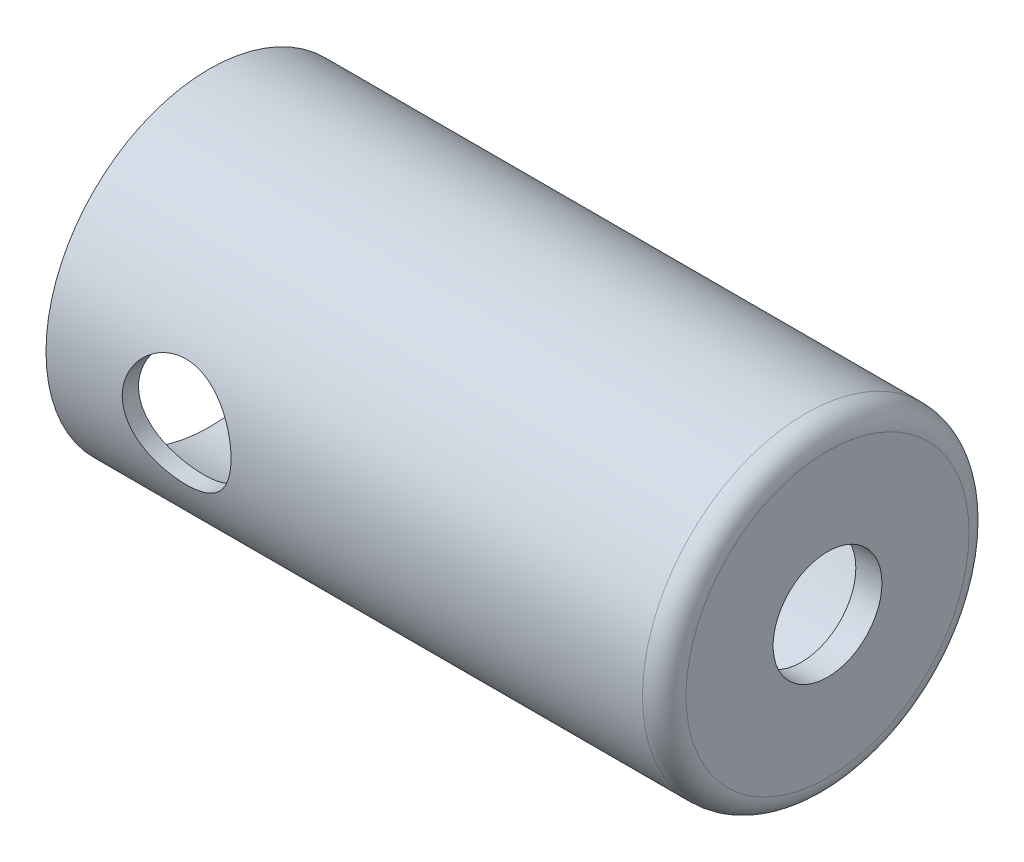
ISO-10303-21;
HEADER;
FILE_DESCRIPTION(('STEP AP214'),'2;1');
FILE_NAME('part.step','',(''),(''),'','','');
FILE_SCHEMA(('AUTOMOTIVE_DESIGN { 1 0 10303 214 1 1 1 1 }'));
ENDSEC;
DATA;
#1=APPLICATION_CONTEXT('core data for automotive mechanical design processes');
#2=APPLICATION_PROTOCOL_DEFINITION('international standard','automotive_design',2000,#1);
#3=PRODUCT_CONTEXT('',#1,'mechanical');
#4=PRODUCT('Part','Part','',(#3));
#5=PRODUCT_RELATED_PRODUCT_CATEGORY('part','',(#4));
#6=PRODUCT_DEFINITION_FORMATION('','',#4);
#7=PRODUCT_DEFINITION_CONTEXT('part definition',#1,'design');
#8=PRODUCT_DEFINITION('design','',#6,#7);
#9=PRODUCT_DEFINITION_SHAPE('','',#8);
#10=(LENGTH_UNIT() NAMED_UNIT(*) SI_UNIT(.MILLI.,.METRE.));
#11=(NAMED_UNIT(*) PLANE_ANGLE_UNIT() SI_UNIT($,.RADIAN.));
#12=(NAMED_UNIT(*) SI_UNIT($,.STERADIAN.) SOLID_ANGLE_UNIT());
#13=UNCERTAINTY_MEASURE_WITH_UNIT(LENGTH_MEASURE(1.E-05),#10,'distance_accuracy_value','');
#14=(GEOMETRIC_REPRESENTATION_CONTEXT(3) GLOBAL_UNCERTAINTY_ASSIGNED_CONTEXT((#13)) GLOBAL_UNIT_ASSIGNED_CONTEXT((#10,
#11,#12)) REPRESENTATION_CONTEXT('',''));
#15=CARTESIAN_POINT('',(0.,0.,0.));
#16=DIRECTION('',(0.,0.,1.));
#17=DIRECTION('',(1.,0.,0.));
#18=AXIS2_PLACEMENT_3D('',#15,#16,#17);
#19=CARTESIAN_POINT('',(-34.0241933122303,-3.71302227001303E-07,-3.57385643930509E-07));
#20=DIRECTION('',(-1.,0.,0.));
#21=DIRECTION('',(0.,0.,1.));
#22=AXIS2_PLACEMENT_3D('',#19,#20,#21);
#23=PLANE('',#22);
#24=CARTESIAN_POINT('',(-34.0241933122303,0.,0.));
#25=DIRECTION('',(-1.,0.,0.));
#26=DIRECTION('',(0.,0.,1.));
#27=AXIS2_PLACEMENT_3D('',#24,#25,#26);
#28=CIRCLE('',#27,6.75);
#29=CARTESIAN_POINT('',(-34.0241933122303,0.,6.75));
#30=VERTEX_POINT('',#29);
#31=EDGE_CURVE('E138',#30,#30,#28,.T.);
#32=ORIENTED_EDGE('',*,*,#31,.F.);
#33=EDGE_LOOP('',(#32));
#34=FACE_BOUND('',#33,.T.);
#35=CARTESIAN_POINT('',(-34.0241933122303,0.,0.));
#36=DIRECTION('',(-1.,0.,0.));
#37=DIRECTION('',(0.,0.,1.));
#38=AXIS2_PLACEMENT_3D('',#35,#36,#37);
#39=CIRCLE('',#38,7.5);
#40=CARTESIAN_POINT('',(-34.0241933122303,0.,7.5));
#41=VERTEX_POINT('',#40);
#42=EDGE_CURVE('E133',#41,#41,#39,.T.);
#43=ORIENTED_EDGE('',*,*,#42,.T.);
#44=EDGE_LOOP('',(#43));
#45=FACE_BOUND('',#44,.T.);
#46=ADVANCED_FACE('F41',(#34,#45),#23,.T.);
#47=CARTESIAN_POINT('',(-5.62419331223025,-3.71302227001303E-07,-3.57385643930509E-07));
#48=DIRECTION('',(1.,0.,0.));
#49=DIRECTION('',(0.,0.,-1.));
#50=AXIS2_PLACEMENT_3D('',#47,#48,#49);
#51=PLANE('',#50);
#52=CARTESIAN_POINT('',(-5.62419331223025,0.,0.));
#53=DIRECTION('',(1.,0.,0.));
#54=DIRECTION('',(0.,0.,-1.));
#55=AXIS2_PLACEMENT_3D('',#52,#53,#54);
#56=CIRCLE('',#55,2.5);
#57=CARTESIAN_POINT('',(-5.62419331223025,0.,-2.5));
#58=VERTEX_POINT('',#57);
#59=EDGE_CURVE('E95',#58,#58,#56,.T.);
#60=ORIENTED_EDGE('',*,*,#59,.F.);
#61=EDGE_LOOP('',(#60));
#62=FACE_BOUND('',#61,.T.);
#63=CARTESIAN_POINT('',(-5.62419331223025,0.,0.));
#64=DIRECTION('',(1.,0.,0.));
#65=DIRECTION('',(0.,0.,-1.));
#66=AXIS2_PLACEMENT_3D('',#63,#64,#65);
#67=CIRCLE('',#66,6.5);
#68=CARTESIAN_POINT('',(-5.62419331223025,0.,-6.5));
#69=VERTEX_POINT('',#68);
#70=EDGE_CURVE('E10',#69,#69,#67,.T.);
#71=ORIENTED_EDGE('',*,*,#70,.T.);
#72=EDGE_LOOP('',(#71));
#73=FACE_BOUND('',#72,.T.);
#74=ADVANCED_FACE('F109',(#62,#73),#51,.T.);
#75=CARTESIAN_POINT('',(-6.82419331223025,-3.71302227001303E-07,-3.57385643930509E-07));
#76=DIRECTION('',(-1.,0.,0.));
#77=DIRECTION('',(0.,0.,1.));
#78=AXIS2_PLACEMENT_3D('',#75,#76,#77);
#79=PLANE('',#78);
#80=CARTESIAN_POINT('',(-6.82419331223026,0.,0.));
#81=DIRECTION('',(-1.,0.,0.));
#82=DIRECTION('',(0.,0.,1.));
#83=AXIS2_PLACEMENT_3D('',#80,#81,#82);
#84=CIRCLE('',#83,2.5);
#85=CARTESIAN_POINT('',(-6.82419331223026,0.,2.5));
#86=VERTEX_POINT('',#85);
#87=EDGE_CURVE('E45',#86,#86,#84,.T.);
#88=ORIENTED_EDGE('',*,*,#87,.F.);
#89=EDGE_LOOP('',(#88));
#90=FACE_BOUND('',#89,.T.);
#91=CARTESIAN_POINT('',(-6.82419331223025,0.,0.));
#92=DIRECTION('',(-1.,0.,0.));
#93=DIRECTION('',(0.,0.,1.));
#94=AXIS2_PLACEMENT_3D('',#91,#92,#93);
#95=CIRCLE('',#94,5.95);
#96=CARTESIAN_POINT('',(-6.82419331223025,0.,5.95));
#97=VERTEX_POINT('',#96);
#98=EDGE_CURVE('E56',#97,#97,#95,.T.);
#99=ORIENTED_EDGE('',*,*,#98,.T.);
#100=EDGE_LOOP('',(#99));
#101=FACE_BOUND('',#100,.T.);
#102=ADVANCED_FACE('F104',(#90,#101),#79,.T.);
#103=CARTESIAN_POINT('',(15.5890101233662,0.,0.));
#104=DIRECTION('',(-1.,0.,0.));
#105=DIRECTION('',(0.,0.,1.));
#106=AXIS2_PLACEMENT_3D('',#103,#104,#105);
#107=CYLINDRICAL_SURFACE('',#106,7.5);
#108=CARTESIAN_POINT('',(-25.5241933122303,0.,-7.5));
#109=CARTESIAN_POINT('',(-25.5241926779012,-0.136408407216808,-7.5000003825236));
#110=CARTESIAN_POINT('',(-25.5353939775483,-0.272812986346375,-7.49624423768862));
#111=CARTESIAN_POINT('',(-25.5797660842733,-0.541604402182431,-7.48163025508202));
#112=CARTESIAN_POINT('',(-25.6129391721026,-0.673990820297045,-7.47077168005381));
#113=CARTESIAN_POINT('',(-25.6999914206904,-0.930831973754439,-7.44313269766107));
#114=CARTESIAN_POINT('',(-25.7538359683784,-1.05529956471508,-7.42636219327133));
#115=CARTESIAN_POINT('',(-25.8805462443261,-1.29343734201331,-7.38861114293355));
#116=CARTESIAN_POINT('',(-25.9534157247368,-1.40710539239676,-7.36762976669445));
#117=CARTESIAN_POINT('',(-26.1187578243771,-1.62435418755567,-7.32285236107513));
#118=CARTESIAN_POINT('',(-26.2117713978815,-1.72750925074577,-7.29898891159462));
#119=CARTESIAN_POINT('',(-26.4136111989967,-1.91708173175521,-7.25150786957804));
#120=CARTESIAN_POINT('',(-26.5224408995515,-2.00349546372365,-7.22789033226373));
#121=CARTESIAN_POINT('',(-26.7566561002214,-2.15956235556965,-7.18283331193184));
#122=CARTESIAN_POINT('',(-26.8824276615606,-2.22866214555258,-7.1614759818922));
#123=CARTESIAN_POINT('',(-27.1446335483766,-2.3445471846943,-7.12438263546503));
#124=CARTESIAN_POINT('',(-27.2810646051371,-2.39133924346691,-7.10864490401864));
#125=CARTESIAN_POINT('',(-27.555876365972,-2.45968365377291,-7.08528258173443));
#126=CARTESIAN_POINT('',(-27.6940363334529,-2.48203362067942,-7.07740239424028));
#127=CARTESIAN_POINT('',(-27.97235269762,-2.50335280833619,-7.06989141573769));
#128=CARTESIAN_POINT('',(-28.1125084640032,-2.50232925401179,-7.07025807556825));
#129=CARTESIAN_POINT('',(-28.3840348883403,-2.47754975925855,-7.0789753752045));
#130=CARTESIAN_POINT('',(-28.5155143195278,-2.45483478291749,-7.08696039668832));
#131=CARTESIAN_POINT('',(-28.7726768612473,-2.38901540712354,-7.10941644311377));
#132=CARTESIAN_POINT('',(-28.8983592758179,-2.34590856647968,-7.12388824460269));
#133=CARTESIAN_POINT('',(-29.142725186209,-2.23984764515053,-7.15794777828122));
#134=CARTESIAN_POINT('',(-29.2612633759041,-2.17658512176816,-7.17761414482793));
#135=CARTESIAN_POINT('',(-29.4863705829296,-2.03222276575785,-7.21981396439316));
#136=CARTESIAN_POINT('',(-29.5929361295637,-1.95111778091001,-7.24234824476159));
#137=CARTESIAN_POINT('',(-29.7969223076322,-1.76837333170559,-7.28918322919352));
#138=CARTESIAN_POINT('',(-29.8935750485029,-1.66588287519078,-7.31351473387107));
#139=CARTESIAN_POINT('',(-30.0685214788888,-1.44584892492516,-7.36017345967592));
#140=CARTESIAN_POINT('',(-30.1468134076415,-1.32830398915203,-7.38250048845168));
#141=CARTESIAN_POINT('',(-30.2834340628179,-1.07986903261567,-7.42292769844484));
#142=CARTESIAN_POINT('',(-30.3415570405821,-0.94885819104084,-7.44098375020098));
#143=CARTESIAN_POINT('',(-30.4347012471195,-0.678172708411269,-7.47051417861087));
#144=CARTESIAN_POINT('',(-30.4697305007888,-0.538501095387383,-7.48199084137198));
#145=CARTESIAN_POINT('',(-30.5143324772862,-0.260959573823259,-7.49669067678601));
#146=CARTESIAN_POINT('',(-30.5249428351621,-0.123273999662115,-7.5002500458432));
#147=CARTESIAN_POINT('',(-30.5233616282341,0.151937674900594,-7.49972256737068));
#148=CARTESIAN_POINT('',(-30.5111739122806,0.289463798299126,-7.49563701048406));
#149=CARTESIAN_POINT('',(-30.4651635428904,0.556299665760639,-7.48050061792761));
#150=CARTESIAN_POINT('',(-30.4319777971065,0.685732017087109,-7.46965496777981));
#151=CARTESIAN_POINT('',(-30.3457097010634,0.937139896448934,-7.44229617075175));
#152=CARTESIAN_POINT('',(-30.2926248135608,1.05911447127152,-7.42578230116688));
#153=CARTESIAN_POINT('',(-30.1665172326283,1.29572074098318,-7.38822328218224));
#154=CARTESIAN_POINT('',(-30.0930068290223,1.41007489804286,-7.36707036889465));
#155=CARTESIAN_POINT('',(-29.9287079371965,1.62516207533896,-7.32263134790656));
#156=CARTESIAN_POINT('',(-29.8379141721508,1.72589091948894,-7.29934458984569));
#157=CARTESIAN_POINT('',(-29.6367464347138,1.91563126951575,-7.25192119951112));
#158=CARTESIAN_POINT('',(-29.5256702449131,2.00390242311443,-7.2277940271857));
#159=CARTESIAN_POINT('',(-29.289764392703,2.16064380580894,-7.18249933236772));
#160=CARTESIAN_POINT('',(-29.1649346156451,2.22911386982753,-7.16133183455006));
#161=CARTESIAN_POINT('',(-28.9050107740055,2.3439923260409,-7.12455979478459));
#162=CARTESIAN_POINT('',(-28.7699381143083,2.39044533041255,-7.10894401982447));
#163=CARTESIAN_POINT('',(-28.4932466871199,2.45973666689839,-7.08527080766124));
#164=CARTESIAN_POINT('',(-28.3516308987194,2.48258563738485,-7.07720996559098));
#165=CARTESIAN_POINT('',(-28.073700572128,2.50319070619335,-7.06994647185443));
#166=CARTESIAN_POINT('',(-27.9374874615132,2.502175643271,-7.07031000643538));
#167=CARTESIAN_POINT('',(-27.6672806249251,2.47810573362173,-7.07878174559669));
#168=CARTESIAN_POINT('',(-27.5332867673425,2.45505219864646,-7.08688948923404));
#169=CARTESIAN_POINT('',(-27.2738541547241,2.38842953282336,-7.10961310762229));
#170=CARTESIAN_POINT('',(-27.148301249719,2.34525836503878,-7.12410245056194));
#171=CARTESIAN_POINT('',(-26.9061247948846,2.23994841439937,-7.15790997046171));
#172=CARTESIAN_POINT('',(-26.7895032342602,2.17780542138451,-7.17722921908483));
#173=CARTESIAN_POINT('',(-26.562984137423,2.03315173145857,-7.21957073065116));
#174=CARTESIAN_POINT('',(-26.4536020574843,1.94987060691145,-7.24271779105343));
#175=CARTESIAN_POINT('',(-26.2499687787698,1.76660720783912,-7.28958390708132));
#176=CARTESIAN_POINT('',(-26.1557218730101,1.6666202111287,-7.31330312280931));
#177=CARTESIAN_POINT('',(-25.9813322815073,1.44810389230172,-7.3597507631386));
#178=CARTESIAN_POINT('',(-25.9018824428528,1.32900378374932,-7.38240454503142));
#179=CARTESIAN_POINT('',(-25.7642172401036,1.07839339351656,-7.4231497793153));
#180=CARTESIAN_POINT('',(-25.7059964474252,0.946886295330872,-7.44124239769824));
#181=CARTESIAN_POINT('',(-25.6148892310086,0.681234118002441,-7.47013787671354));
#182=CARTESIAN_POINT('',(-25.5809871465718,0.547469394191023,-7.48123031056307));
#183=CARTESIAN_POINT('',(-25.5356426105374,0.275801040025618,-7.49616017660555));
#184=CARTESIAN_POINT('',(-25.5241939534889,0.137898563921866,-7.49999961329762));
#185=CARTESIAN_POINT('',(-25.5241933122303,0.,-7.5));
#186=B_SPLINE_CURVE_WITH_KNOTS('',3,(#108,#109,#110,#111,#112,#113,#114,#115,#116,#117,#118,
#119,#120,#121,#122,#123,#124,#125,#126,#127,#128,#129,#130,#131,#132,#133,#134,#135,#136,#137,
#138,#139,#140,#141,#142,#143,#144,#145,#146,#147,#148,#149,#150,#151,#152,#153,#154,#155,#156,
#157,#158,#159,#160,#161,#162,#163,#164,#165,#166,#167,#168,#169,#170,#171,#172,#173,#174,#175,
#176,#177,#178,#179,#180,#181,#182,#183,#184,#185),.UNSPECIFIED.,.T.,.F.,(4,2,2,2,2,2,2,2,2,2,2,
2,2,2,2,2,2,2,2,2,2,2,2,2,2,2,2,2,2,2,2,2,2,2,2,2,2,2,4),(0.,0.408717765065027,
0.817477963168802,1.22555668217568,1.63371594449775,2.0546171070689,2.47561083218826,
2.90870962058677,3.34167611732083,3.760048143546,4.17829084968713,4.577420663782,
4.97659827138705,5.38220427887826,5.78792756395518,6.21483264528417,6.64177864916546,
7.07296014125894,7.5039917219302,7.91633957937924,8.32861782910441,8.72895394945533,
9.12934113210259,9.54025999609341,9.95130452054727,10.3810255720188,10.8107502058749,
11.2396003456693,11.668257117646,12.0748916516064,12.4815019837844,12.8803896770104,
13.2793659543994,13.6957516672951,14.1122552780945,14.5449915208775,14.9776170288114,
15.3909139593453,15.8040966509535),.UNSPECIFIED.);
#187=CARTESIAN_POINT('',(-25.5241933122303,0.,-7.5));
#188=VERTEX_POINT('',#187);
#189=EDGE_CURVE('E94',#188,#188,#186,.T.);
#190=ORIENTED_EDGE('',*,*,#189,.F.);
#191=EDGE_LOOP('',(#190));
#192=FACE_BOUND('',#191,.T.);
#193=CARTESIAN_POINT('',(-25.5241933122303,0.,7.5));
#194=CARTESIAN_POINT('',(-25.5241926779012,0.136408407216808,7.5000003825236));
#195=CARTESIAN_POINT('',(-25.5353939775483,0.272812986346375,7.49624423768862));
#196=CARTESIAN_POINT('',(-25.5797660842733,0.541604402182431,7.48163025508202));
#197=CARTESIAN_POINT('',(-25.6129391721026,0.673990820297045,7.47077168005381));
#198=CARTESIAN_POINT('',(-25.6999914206904,0.930831973754439,7.44313269766107));
#199=CARTESIAN_POINT('',(-25.7538359683784,1.05529956471508,7.42636219327133));
#200=CARTESIAN_POINT('',(-25.8805462443261,1.29343734201331,7.38861114293355));
#201=CARTESIAN_POINT('',(-25.9534157247368,1.40710539239676,7.36762976669445));
#202=CARTESIAN_POINT('',(-26.1187578243771,1.62435418755567,7.32285236107513));
#203=CARTESIAN_POINT('',(-26.2117713978815,1.72750925074577,7.29898891159462));
#204=CARTESIAN_POINT('',(-26.4136111989967,1.91708173175521,7.25150786957804));
#205=CARTESIAN_POINT('',(-26.5224408995515,2.00349546372365,7.22789033226373));
#206=CARTESIAN_POINT('',(-26.7566561002214,2.15956235556965,7.18283331193184));
#207=CARTESIAN_POINT('',(-26.8824276615606,2.22866214555258,7.1614759818922));
#208=CARTESIAN_POINT('',(-27.1446335483766,2.3445471846943,7.12438263546503));
#209=CARTESIAN_POINT('',(-27.2810646051371,2.39133924346691,7.10864490401864));
#210=CARTESIAN_POINT('',(-27.555876365972,2.45968365377291,7.08528258173443));
#211=CARTESIAN_POINT('',(-27.6940363334529,2.48203362067942,7.07740239424028));
#212=CARTESIAN_POINT('',(-27.97235269762,2.50335280833619,7.06989141573769));
#213=CARTESIAN_POINT('',(-28.1125084640032,2.50232925401179,7.07025807556825));
#214=CARTESIAN_POINT('',(-28.3840348883403,2.47754975925855,7.0789753752045));
#215=CARTESIAN_POINT('',(-28.5155143195278,2.45483478291749,7.08696039668832));
#216=CARTESIAN_POINT('',(-28.7726768612473,2.38901540712354,7.10941644311377));
#217=CARTESIAN_POINT('',(-28.8983592758179,2.34590856647968,7.12388824460269));
#218=CARTESIAN_POINT('',(-29.142725186209,2.23984764515053,7.15794777828122));
#219=CARTESIAN_POINT('',(-29.2612633759041,2.17658512176816,7.17761414482793));
#220=CARTESIAN_POINT('',(-29.4863705829296,2.03222276575785,7.21981396439316));
#221=CARTESIAN_POINT('',(-29.5929361295637,1.95111778091001,7.24234824476159));
#222=CARTESIAN_POINT('',(-29.7969223076322,1.76837333170559,7.28918322919352));
#223=CARTESIAN_POINT('',(-29.8935750485029,1.66588287519078,7.31351473387107));
#224=CARTESIAN_POINT('',(-30.0685214788888,1.44584892492516,7.36017345967592));
#225=CARTESIAN_POINT('',(-30.1468134076415,1.32830398915203,7.38250048845168));
#226=CARTESIAN_POINT('',(-30.2834340628179,1.07986903261567,7.42292769844484));
#227=CARTESIAN_POINT('',(-30.3415570405821,0.94885819104084,7.44098375020098));
#228=CARTESIAN_POINT('',(-30.4347012471195,0.678172708411269,7.47051417861087));
#229=CARTESIAN_POINT('',(-30.4697305007888,0.538501095387383,7.48199084137198));
#230=CARTESIAN_POINT('',(-30.5143324772862,0.260959573823259,7.49669067678601));
#231=CARTESIAN_POINT('',(-30.5249428351621,0.123273999662115,7.5002500458432));
#232=CARTESIAN_POINT('',(-30.5233616282341,-0.151937674900594,7.49972256737068));
#233=CARTESIAN_POINT('',(-30.5111739122806,-0.289463798299126,7.49563701048406));
#234=CARTESIAN_POINT('',(-30.4651635428904,-0.556299665760639,7.48050061792761));
#235=CARTESIAN_POINT('',(-30.4319777971065,-0.685732017087109,7.46965496777981));
#236=CARTESIAN_POINT('',(-30.3457097010634,-0.937139896448934,7.44229617075175));
#237=CARTESIAN_POINT('',(-30.2926248135608,-1.05911447127152,7.42578230116688));
#238=CARTESIAN_POINT('',(-30.1665172326283,-1.29572074098318,7.38822328218224));
#239=CARTESIAN_POINT('',(-30.0930068290223,-1.41007489804286,7.36707036889465));
#240=CARTESIAN_POINT('',(-29.9287079371965,-1.62516207533896,7.32263134790656));
#241=CARTESIAN_POINT('',(-29.8379141721508,-1.72589091948894,7.29934458984569));
#242=CARTESIAN_POINT('',(-29.6367464347138,-1.91563126951575,7.25192119951112));
#243=CARTESIAN_POINT('',(-29.5256702449131,-2.00390242311443,7.2277940271857));
#244=CARTESIAN_POINT('',(-29.289764392703,-2.16064380580894,7.18249933236772));
#245=CARTESIAN_POINT('',(-29.1649346156451,-2.22911386982753,7.16133183455006));
#246=CARTESIAN_POINT('',(-28.9050107740055,-2.3439923260409,7.12455979478459));
#247=CARTESIAN_POINT('',(-28.7699381143083,-2.39044533041255,7.10894401982447));
#248=CARTESIAN_POINT('',(-28.4932466871199,-2.45973666689839,7.08527080766124));
#249=CARTESIAN_POINT('',(-28.3516308987194,-2.48258563738485,7.07720996559098));
#250=CARTESIAN_POINT('',(-28.073700572128,-2.50319070619335,7.06994647185443));
#251=CARTESIAN_POINT('',(-27.9374874615132,-2.502175643271,7.07031000643538));
#252=CARTESIAN_POINT('',(-27.6672806249251,-2.47810573362173,7.07878174559669));
#253=CARTESIAN_POINT('',(-27.5332867673425,-2.45505219864646,7.08688948923404));
#254=CARTESIAN_POINT('',(-27.2738541547241,-2.38842953282336,7.10961310762229));
#255=CARTESIAN_POINT('',(-27.148301249719,-2.34525836503878,7.12410245056194));
#256=CARTESIAN_POINT('',(-26.9061247948846,-2.23994841439937,7.15790997046171));
#257=CARTESIAN_POINT('',(-26.7895032342602,-2.17780542138451,7.17722921908483));
#258=CARTESIAN_POINT('',(-26.562984137423,-2.03315173145857,7.21957073065116));
#259=CARTESIAN_POINT('',(-26.4536020574843,-1.94987060691145,7.24271779105343));
#260=CARTESIAN_POINT('',(-26.2499687787698,-1.76660720783912,7.28958390708132));
#261=CARTESIAN_POINT('',(-26.1557218730101,-1.6666202111287,7.31330312280931));
#262=CARTESIAN_POINT('',(-25.9813322815073,-1.44810389230172,7.3597507631386));
#263=CARTESIAN_POINT('',(-25.9018824428528,-1.32900378374932,7.38240454503142));
#264=CARTESIAN_POINT('',(-25.7642172401036,-1.07839339351656,7.4231497793153));
#265=CARTESIAN_POINT('',(-25.7059964474252,-0.946886295330872,7.44124239769824));
#266=CARTESIAN_POINT('',(-25.6148892310086,-0.681234118002441,7.47013787671354));
#267=CARTESIAN_POINT('',(-25.5809871465718,-0.547469394191023,7.48123031056307));
#268=CARTESIAN_POINT('',(-25.5356426105374,-0.275801040025618,7.49616017660555));
#269=CARTESIAN_POINT('',(-25.5241939534889,-0.137898563921866,7.49999961329762));
#270=CARTESIAN_POINT('',(-25.5241933122303,0.,7.5));
#271=B_SPLINE_CURVE_WITH_KNOTS('',3,(#193,#194,#195,#196,#197,#198,#199,#200,#201,#202,#203,
#204,#205,#206,#207,#208,#209,#210,#211,#212,#213,#214,#215,#216,#217,#218,#219,#220,#221,#222,
#223,#224,#225,#226,#227,#228,#229,#230,#231,#232,#233,#234,#235,#236,#237,#238,#239,#240,#241,
#242,#243,#244,#245,#246,#247,#248,#249,#250,#251,#252,#253,#254,#255,#256,#257,#258,#259,#260,
#261,#262,#263,#264,#265,#266,#267,#268,#269,#270),.UNSPECIFIED.,.T.,.F.,(4,2,2,2,2,2,2,2,2,2,2,
2,2,2,2,2,2,2,2,2,2,2,2,2,2,2,2,2,2,2,2,2,2,2,2,2,2,2,4),(0.,0.408717765065027,
0.817477963168802,1.22555668217568,1.63371594449775,2.0546171070689,2.47561083218826,
2.90870962058677,3.34167611732083,3.760048143546,4.17829084968713,4.577420663782,
4.97659827138705,5.38220427887826,5.78792756395518,6.21483264528417,6.64177864916546,
7.07296014125894,7.5039917219302,7.91633957937924,8.32861782910441,8.72895394945533,
9.12934113210259,9.54025999609341,9.95130452054727,10.3810255720188,10.8107502058749,
11.2396003456693,11.668257117646,12.0748916516064,12.4815019837844,12.8803896770104,
13.2793659543994,13.6957516672951,14.1122552780945,14.5449915208775,14.9776170288114,
15.3909139593453,15.8040966509535),.UNSPECIFIED.);
#272=CARTESIAN_POINT('',(-25.5241933122303,0.,7.5));
#273=VERTEX_POINT('',#272);
#274=EDGE_CURVE('E87',#273,#273,#271,.T.);
#275=ORIENTED_EDGE('',*,*,#274,.F.);
#276=EDGE_LOOP('',(#275));
#277=FACE_BOUND('',#276,.T.);
#278=CARTESIAN_POINT('',(-6.62419331223026,0.,0.));
#279=DIRECTION('',(1.,0.,0.));
#280=DIRECTION('',(0.,0.,-1.));
#281=AXIS2_PLACEMENT_3D('',#278,#279,#280);
#282=CIRCLE('',#281,7.5);
#283=CARTESIAN_POINT('',(-6.62419331223026,0.,-7.5));
#284=VERTEX_POINT('',#283);
#285=EDGE_CURVE('E50',#284,#284,#282,.F.);
#286=ORIENTED_EDGE('',*,*,#285,.T.);
#287=EDGE_LOOP('',(#286));
#288=FACE_BOUND('',#287,.T.);
#289=ORIENTED_EDGE('',*,*,#42,.F.);
#290=EDGE_LOOP('',(#289));
#291=FACE_BOUND('',#290,.T.);
#292=ADVANCED_FACE('F100',(#192,#277,#288,#291),#107,.T.);
#293=CARTESIAN_POINT('',(12.2676897798065,0.,0.));
#294=DIRECTION('',(-1.,0.,0.));
#295=DIRECTION('',(0.,0.,1.));
#296=AXIS2_PLACEMENT_3D('',#293,#294,#295);
#297=CYLINDRICAL_SURFACE('',#296,6.75);
#298=CARTESIAN_POINT('',(-25.5241933122303,0.,6.75));
#299=CARTESIAN_POINT('',(-25.5241890307394,0.135509654708788,6.75000317808274));
#300=CARTESIAN_POINT('',(-25.535245659211,0.270989631404843,6.74588359903948));
#301=CARTESIAN_POINT('',(-25.5790061967198,0.537907202079725,6.72986075571527));
#302=CARTESIAN_POINT('',(-25.6117075783133,0.669345266155043,6.71795840022599));
#303=CARTESIAN_POINT('',(-25.6974468325456,0.924291470650452,6.68764945344539));
#304=CARTESIAN_POINT('',(-25.7504460711499,1.04781415863334,6.66925522368532));
#305=CARTESIAN_POINT('',(-25.8750826155024,1.28420806849619,6.62779980156249));
#306=CARTESIAN_POINT('',(-25.9467247875989,1.39707649880627,6.60473739101832));
#307=CARTESIAN_POINT('',(-26.1097271569463,1.61365139255387,6.55526013897375));
#308=CARTESIAN_POINT('',(-26.2017258137335,1.71685583080606,6.52875203767317));
#309=CARTESIAN_POINT('',(-26.4014741630718,1.90677342276443,6.47583603903213));
#310=CARTESIAN_POINT('',(-26.5092284899395,1.99348170702375,6.44942817352747));
#311=CARTESIAN_POINT('',(-26.7422894089744,2.15109917797836,6.39862457901487));
#312=CARTESIAN_POINT('',(-26.8680976003946,2.22130583365779,6.37433931945552));
#313=CARTESIAN_POINT('',(-27.130777558453,2.33934135373528,6.33197789809035));
#314=CARTESIAN_POINT('',(-27.2676450052106,2.38717890669519,6.31389932622184));
#315=CARTESIAN_POINT('',(-27.5427860523275,2.45714769592577,6.28699353511211));
#316=CARTESIAN_POINT('',(-27.6807818397204,2.48023519894605,6.27782356290439));
#317=CARTESIAN_POINT('',(-27.9589701692321,2.5030386009384,6.2687688917512));
#318=CARTESIAN_POINT('',(-28.0991618100109,2.50276385051425,6.2688804779165));
#319=CARTESIAN_POINT('',(-28.3690856152694,2.47958305780104,6.27808021698506));
#320=CARTESIAN_POINT('',(-28.4989519570352,2.45799393127311,6.2866460142992));
#321=CARTESIAN_POINT('',(-28.7530674411233,2.39497095093856,6.31092247704976));
#322=CARTESIAN_POINT('',(-28.8773157556761,2.35353418310718,6.32663419163052));
#323=CARTESIAN_POINT('',(-29.1193875253982,2.25125336244831,6.36375319413816));
#324=CARTESIAN_POINT('',(-29.2370482283149,2.19006224127379,6.38526110663422));
#325=CARTESIAN_POINT('',(-29.4608175280402,2.05025146622898,6.43151460549225));
#326=CARTESIAN_POINT('',(-29.566922187929,1.97162590030497,6.45626128895844));
#327=CARTESIAN_POINT('',(-29.7718704626827,1.79311866002029,6.50817972601199));
#328=CARTESIAN_POINT('',(-29.8697847428579,1.69218280045221,6.53540420922844));
#329=CARTESIAN_POINT('',(-30.0475691200759,1.47500720143787,6.58781595534807));
#330=CARTESIAN_POINT('',(-30.127436578349,1.35876522789037,6.61300291998419));
#331=CARTESIAN_POINT('',(-30.2678515895703,1.11195348618003,6.65898079524328));
#332=CARTESIAN_POINT('',(-30.3280967281516,0.98119763794806,6.67970136782945));
#333=CARTESIAN_POINT('',(-30.4254287156019,0.710449107060539,6.71389155301427));
#334=CARTESIAN_POINT('',(-30.462525587331,0.570460451146775,6.72736430346473));
#335=CARTESIAN_POINT('',(-30.5107378044549,0.293046902047139,6.74499292936482));
#336=CARTESIAN_POINT('',(-30.5231050703056,0.155867868749339,6.74959727814305));
#337=CARTESIAN_POINT('',(-30.5251431574798,-0.118666367946143,6.75035146451062));
#338=CARTESIAN_POINT('',(-30.5148188648194,-0.256021527055126,6.74650312215956));
#339=CARTESIAN_POINT('',(-30.4727234365349,-0.521645713797059,6.73108038811266));
#340=CARTESIAN_POINT('',(-30.4417663905617,-0.650062565883156,6.71979944505082));
#341=CARTESIAN_POINT('',(-30.3603497838552,-0.899793997744735,6.69094045390406));
#342=CARTESIAN_POINT('',(-30.3098876854206,-1.021107650994,6.67336158645063));
#343=CARTESIAN_POINT('',(-30.1892954480883,-1.25714280005761,6.6330123497537));
#344=CARTESIAN_POINT('',(-30.1186356731996,-1.37156971177179,6.610105786837));
#345=CARTESIAN_POINT('',(-29.960255022327,-1.58732145596668,6.56164288494223));
#346=CARTESIAN_POINT('',(-29.8725279591859,-1.68864151476571,6.53608558660478));
#347=CARTESIAN_POINT('',(-29.6766598450678,-1.88129512905151,6.48334540951822));
#348=CARTESIAN_POINT('',(-29.567644745375,-1.97173956749332,6.45615235569299));
#349=CARTESIAN_POINT('',(-29.3354424033557,-2.13321900921777,6.40461414897312));
#350=CARTESIAN_POINT('',(-29.2122540535021,-2.20425249422263,6.38026921893693));
#351=CARTESIAN_POINT('',(-28.9543165065846,-2.32490824016839,6.33730536263928));
#352=CARTESIAN_POINT('',(-28.8195306898946,-2.37445945649572,6.3187054934627));
#353=CARTESIAN_POINT('',(-28.5426503327094,-2.44984819447265,6.28986522846778));
#354=CARTESIAN_POINT('',(-28.4005602169848,-2.47569989804497,6.27961983369084));
#355=CARTESIAN_POINT('',(-28.1227120997905,-2.50170547072987,6.26930193089658));
#356=CARTESIAN_POINT('',(-27.9871165511776,-2.50337068020084,6.26863118103368));
#357=CARTESIAN_POINT('',(-27.7176869126447,-2.48481041239422,6.27601107723022));
#358=CARTESIAN_POINT('',(-27.5838526651423,-2.46458690715063,6.28406093761818));
#359=CARTESIAN_POINT('',(-27.3256810737736,-2.4039887085709,6.30748280344268));
#360=CARTESIAN_POINT('',(-27.2011808175303,-2.36421610742746,6.32263544113566));
#361=CARTESIAN_POINT('',(-26.9605442349706,-2.26617352175882,6.35843280578179));
#362=CARTESIAN_POINT('',(-26.844410006773,-2.20789891678774,6.37907890439046));
#363=CARTESIAN_POINT('',(-26.6173045733761,-2.071022918196,6.42485953015808));
#364=CARTESIAN_POINT('',(-26.5069069126224,-1.99152956188092,6.4501704019665));
#365=CARTESIAN_POINT('',(-26.3005344894536,-1.81586772133999,6.50180728186284));
#366=CARTESIAN_POINT('',(-26.2045642708566,-1.71969400420875,6.52813360649368));
#367=CARTESIAN_POINT('',(-26.024663485889,-1.50739052523104,6.58048775479275));
#368=CARTESIAN_POINT('',(-25.9416242222213,-1.3904805187966,6.6064280780175));
#369=CARTESIAN_POINT('',(-25.7964079548908,-1.14345802388774,6.65363057421822));
#370=CARTESIAN_POINT('',(-25.7342317103645,-1.0133450552253,6.67489257695583));
#371=CARTESIAN_POINT('',(-25.6312811595677,-0.739000476129699,6.7108947735399));
#372=CARTESIAN_POINT('',(-25.5912798382286,-0.594444858224903,6.72539690065952));
#373=CARTESIAN_POINT('',(-25.5377445055618,-0.299912326852294,6.74494553271336));
#374=CARTESIAN_POINT('',(-25.5241980495913,-0.149937996236527,6.74999648353205));
#375=CARTESIAN_POINT('',(-25.5241933122303,0.,6.75));
#376=B_SPLINE_CURVE_WITH_KNOTS('',3,(#298,#299,#300,#301,#302,#303,#304,#305,#306,#307,#308,
#309,#310,#311,#312,#313,#314,#315,#316,#317,#318,#319,#320,#321,#322,#323,#324,#325,#326,#327,
#328,#329,#330,#331,#332,#333,#334,#335,#336,#337,#338,#339,#340,#341,#342,#343,#344,#345,#346,
#347,#348,#349,#350,#351,#352,#353,#354,#355,#356,#357,#358,#359,#360,#361,#362,#363,#364,#365,
#366,#367,#368,#369,#370,#371,#372,#373,#374,#375),.UNSPECIFIED.,.T.,.F.,(4,2,2,2,2,2,2,2,2,2,2,
2,2,2,2,2,2,2,2,2,2,2,2,2,2,2,2,2,2,2,2,2,2,2,2,2,2,2,4),(0.,0.405976059320643,
0.811904721444865,1.21706456633057,1.62233027600351,2.04278724613508,2.46336813769239,
2.89949652532433,3.33545537184403,3.75388507857464,4.17214731207812,4.56608801948411,
4.96008658288414,5.36142296569409,5.7628956511357,6.19063672203941,6.61844029596376,
7.05255534622331,7.4864823003666,7.89782169009939,8.30907251764561,8.70498816292931,
9.10095533609168,9.5084458124709,9.91608428666993,10.3467817225607,10.7775128369256,
11.2096577651108,11.641543926201,12.0463178059657,12.4510552212131,12.8440419700306,
13.2371269354585,13.6504473226395,14.0638976105857,14.4989549133145,14.9340280446298,
15.383441718016,15.8326439315804),.UNSPECIFIED.);
#377=CARTESIAN_POINT('',(-25.5241933122303,0.,6.75));
#378=VERTEX_POINT('',#377);
#379=EDGE_CURVE('E68',#378,#378,#376,.T.);
#380=ORIENTED_EDGE('',*,*,#379,.T.);
#381=EDGE_LOOP('',(#380));
#382=FACE_BOUND('',#381,.T.);
#383=CARTESIAN_POINT('',(-25.5241933122303,0.,-6.75));
#384=CARTESIAN_POINT('',(-25.5241890307394,-0.135509654708788,-6.75000317808274));
#385=CARTESIAN_POINT('',(-25.535245659211,-0.270989631404843,-6.74588359903948));
#386=CARTESIAN_POINT('',(-25.5790061967198,-0.537907202079725,-6.72986075571527));
#387=CARTESIAN_POINT('',(-25.6117075783133,-0.669345266155043,-6.71795840022599));
#388=CARTESIAN_POINT('',(-25.6974468325456,-0.924291470650452,-6.68764945344539));
#389=CARTESIAN_POINT('',(-25.7504460711499,-1.04781415863334,-6.66925522368532));
#390=CARTESIAN_POINT('',(-25.8750826155024,-1.28420806849619,-6.62779980156249));
#391=CARTESIAN_POINT('',(-25.9467247875989,-1.39707649880627,-6.60473739101832));
#392=CARTESIAN_POINT('',(-26.1097271569463,-1.61365139255387,-6.55526013897375));
#393=CARTESIAN_POINT('',(-26.2017258137335,-1.71685583080606,-6.52875203767317));
#394=CARTESIAN_POINT('',(-26.4014741630718,-1.90677342276443,-6.47583603903213));
#395=CARTESIAN_POINT('',(-26.5092284899395,-1.99348170702375,-6.44942817352747));
#396=CARTESIAN_POINT('',(-26.7422894089744,-2.15109917797836,-6.39862457901487));
#397=CARTESIAN_POINT('',(-26.8680976003946,-2.22130583365779,-6.37433931945552));
#398=CARTESIAN_POINT('',(-27.130777558453,-2.33934135373528,-6.33197789809035));
#399=CARTESIAN_POINT('',(-27.2676450052106,-2.38717890669519,-6.31389932622184));
#400=CARTESIAN_POINT('',(-27.5427860523275,-2.45714769592577,-6.28699353511211));
#401=CARTESIAN_POINT('',(-27.6807818397204,-2.48023519894605,-6.27782356290439));
#402=CARTESIAN_POINT('',(-27.9589701692321,-2.5030386009384,-6.2687688917512));
#403=CARTESIAN_POINT('',(-28.0991618100109,-2.50276385051425,-6.2688804779165));
#404=CARTESIAN_POINT('',(-28.3690856152694,-2.47958305780104,-6.27808021698506));
#405=CARTESIAN_POINT('',(-28.4989519570352,-2.45799393127311,-6.2866460142992));
#406=CARTESIAN_POINT('',(-28.7530674411233,-2.39497095093856,-6.31092247704976));
#407=CARTESIAN_POINT('',(-28.8773157556761,-2.35353418310718,-6.32663419163052));
#408=CARTESIAN_POINT('',(-29.1193875253982,-2.25125336244831,-6.36375319413816));
#409=CARTESIAN_POINT('',(-29.2370482283149,-2.19006224127379,-6.38526110663422));
#410=CARTESIAN_POINT('',(-29.4608175280402,-2.05025146622898,-6.43151460549225));
#411=CARTESIAN_POINT('',(-29.566922187929,-1.97162590030497,-6.45626128895844));
#412=CARTESIAN_POINT('',(-29.7718704626827,-1.79311866002029,-6.50817972601199));
#413=CARTESIAN_POINT('',(-29.8697847428579,-1.69218280045221,-6.53540420922844));
#414=CARTESIAN_POINT('',(-30.0475691200759,-1.47500720143787,-6.58781595534807));
#415=CARTESIAN_POINT('',(-30.127436578349,-1.35876522789037,-6.61300291998419));
#416=CARTESIAN_POINT('',(-30.2678515895703,-1.11195348618003,-6.65898079524328));
#417=CARTESIAN_POINT('',(-30.3280967281516,-0.98119763794806,-6.67970136782945));
#418=CARTESIAN_POINT('',(-30.4254287156019,-0.710449107060539,-6.71389155301427));
#419=CARTESIAN_POINT('',(-30.462525587331,-0.570460451146775,-6.72736430346473));
#420=CARTESIAN_POINT('',(-30.5107378044549,-0.293046902047139,-6.74499292936482));
#421=CARTESIAN_POINT('',(-30.5231050703056,-0.155867868749339,-6.74959727814305));
#422=CARTESIAN_POINT('',(-30.5251431574798,0.118666367946143,-6.75035146451062));
#423=CARTESIAN_POINT('',(-30.5148188648194,0.256021527055126,-6.74650312215956));
#424=CARTESIAN_POINT('',(-30.4727234365349,0.521645713797059,-6.73108038811266));
#425=CARTESIAN_POINT('',(-30.4417663905617,0.650062565883156,-6.71979944505082));
#426=CARTESIAN_POINT('',(-30.3603497838552,0.899793997744735,-6.69094045390406));
#427=CARTESIAN_POINT('',(-30.3098876854206,1.021107650994,-6.67336158645063));
#428=CARTESIAN_POINT('',(-30.1892954480883,1.25714280005761,-6.6330123497537));
#429=CARTESIAN_POINT('',(-30.1186356731996,1.37156971177179,-6.610105786837));
#430=CARTESIAN_POINT('',(-29.960255022327,1.58732145596668,-6.56164288494223));
#431=CARTESIAN_POINT('',(-29.8725279591859,1.68864151476571,-6.53608558660478));
#432=CARTESIAN_POINT('',(-29.6766598450678,1.88129512905151,-6.48334540951822));
#433=CARTESIAN_POINT('',(-29.567644745375,1.97173956749332,-6.45615235569299));
#434=CARTESIAN_POINT('',(-29.3354424033557,2.13321900921777,-6.40461414897312));
#435=CARTESIAN_POINT('',(-29.2122540535021,2.20425249422263,-6.38026921893693));
#436=CARTESIAN_POINT('',(-28.9543165065846,2.32490824016839,-6.33730536263928));
#437=CARTESIAN_POINT('',(-28.8195306898946,2.37445945649572,-6.3187054934627));
#438=CARTESIAN_POINT('',(-28.5426503327094,2.44984819447265,-6.28986522846778));
#439=CARTESIAN_POINT('',(-28.4005602169848,2.47569989804497,-6.27961983369084));
#440=CARTESIAN_POINT('',(-28.1227120997905,2.50170547072987,-6.26930193089658));
#441=CARTESIAN_POINT('',(-27.9871165511776,2.50337068020084,-6.26863118103368));
#442=CARTESIAN_POINT('',(-27.7176869126447,2.48481041239422,-6.27601107723022));
#443=CARTESIAN_POINT('',(-27.5838526651423,2.46458690715063,-6.28406093761818));
#444=CARTESIAN_POINT('',(-27.3256810737736,2.4039887085709,-6.30748280344268));
#445=CARTESIAN_POINT('',(-27.2011808175303,2.36421610742746,-6.32263544113566));
#446=CARTESIAN_POINT('',(-26.9605442349706,2.26617352175882,-6.35843280578179));
#447=CARTESIAN_POINT('',(-26.844410006773,2.20789891678774,-6.37907890439046));
#448=CARTESIAN_POINT('',(-26.6173045733761,2.071022918196,-6.42485953015808));
#449=CARTESIAN_POINT('',(-26.5069069126224,1.99152956188092,-6.4501704019665));
#450=CARTESIAN_POINT('',(-26.3005344894536,1.81586772133999,-6.50180728186284));
#451=CARTESIAN_POINT('',(-26.2045642708566,1.71969400420875,-6.52813360649368));
#452=CARTESIAN_POINT('',(-26.024663485889,1.50739052523104,-6.58048775479275));
#453=CARTESIAN_POINT('',(-25.9416242222213,1.3904805187966,-6.6064280780175));
#454=CARTESIAN_POINT('',(-25.7964079548908,1.14345802388774,-6.65363057421822));
#455=CARTESIAN_POINT('',(-25.7342317103645,1.0133450552253,-6.67489257695583));
#456=CARTESIAN_POINT('',(-25.6312811595677,0.739000476129699,-6.7108947735399));
#457=CARTESIAN_POINT('',(-25.5912798382286,0.594444858224903,-6.72539690065952));
#458=CARTESIAN_POINT('',(-25.5377445055618,0.299912326852294,-6.74494553271336));
#459=CARTESIAN_POINT('',(-25.5241980495913,0.149937996236527,-6.74999648353205));
#460=CARTESIAN_POINT('',(-25.5241933122303,0.,-6.75));
#461=B_SPLINE_CURVE_WITH_KNOTS('',3,(#383,#384,#385,#386,#387,#388,#389,#390,#391,#392,#393,
#394,#395,#396,#397,#398,#399,#400,#401,#402,#403,#404,#405,#406,#407,#408,#409,#410,#411,#412,
#413,#414,#415,#416,#417,#418,#419,#420,#421,#422,#423,#424,#425,#426,#427,#428,#429,#430,#431,
#432,#433,#434,#435,#436,#437,#438,#439,#440,#441,#442,#443,#444,#445,#446,#447,#448,#449,#450,
#451,#452,#453,#454,#455,#456,#457,#458,#459,#460),.UNSPECIFIED.,.T.,.F.,(4,2,2,2,2,2,2,2,2,2,2,
2,2,2,2,2,2,2,2,2,2,2,2,2,2,2,2,2,2,2,2,2,2,2,2,2,2,2,4),(0.,0.405976059320643,
0.811904721444865,1.21706456633057,1.62233027600351,2.04278724613508,2.46336813769239,
2.89949652532433,3.33545537184403,3.75388507857464,4.17214731207812,4.56608801948411,
4.96008658288414,5.36142296569409,5.7628956511357,6.19063672203941,6.61844029596376,
7.05255534622331,7.4864823003666,7.89782169009939,8.30907251764561,8.70498816292931,
9.10095533609168,9.5084458124709,9.91608428666993,10.3467817225607,10.7775128369256,
11.2096577651108,11.641543926201,12.0463178059657,12.4510552212131,12.8440419700306,
13.2371269354585,13.6504473226395,14.0638976105857,14.4989549133145,14.9340280446298,
15.383441718016,15.8326439315804),.UNSPECIFIED.);
#462=CARTESIAN_POINT('',(-25.5241933122303,0.,-6.75));
#463=VERTEX_POINT('',#462);
#464=EDGE_CURVE('E60',#463,#463,#461,.T.);
#465=ORIENTED_EDGE('',*,*,#464,.T.);
#466=EDGE_LOOP('',(#465));
#467=FACE_BOUND('',#466,.T.);
#468=CARTESIAN_POINT('',(-7.62419331223025,0.,0.));
#469=DIRECTION('',(-1.,0.,0.));
#470=DIRECTION('',(0.,0.,1.));
#471=AXIS2_PLACEMENT_3D('',#468,#469,#470);
#472=CIRCLE('',#471,6.75);
#473=CARTESIAN_POINT('',(-7.62419331223025,0.,6.75));
#474=VERTEX_POINT('',#473);
#475=EDGE_CURVE('E130',#474,#474,#472,.F.);
#476=ORIENTED_EDGE('',*,*,#475,.T.);
#477=EDGE_LOOP('',(#476));
#478=FACE_BOUND('',#477,.T.);
#479=ORIENTED_EDGE('',*,*,#31,.T.);
#480=EDGE_LOOP('',(#479));
#481=FACE_BOUND('',#480,.T.);
#482=ADVANCED_FACE('F72',(#382,#467,#478,#481),#297,.F.);
#483=CARTESIAN_POINT('',(-7.62419331223025,0.,0.));
#484=DIRECTION('',(-1.,0.,0.));
#485=DIRECTION('',(0.,0.,1.));
#486=AXIS2_PLACEMENT_3D('',#483,#484,#485);
#487=TOROIDAL_SURFACE('',#486,5.95,0.8);
#488=ORIENTED_EDGE('',*,*,#98,.F.);
#489=EDGE_LOOP('',(#488));
#490=FACE_BOUND('',#489,.T.);
#491=ORIENTED_EDGE('',*,*,#475,.F.);
#492=EDGE_LOOP('',(#491));
#493=FACE_BOUND('',#492,.T.);
#494=ADVANCED_FACE('F116',(#490,#493),#487,.F.);
#495=CARTESIAN_POINT('',(-6.62419331223026,0.,0.));
#496=DIRECTION('',(1.,0.,0.));
#497=DIRECTION('',(0.,0.,-1.));
#498=AXIS2_PLACEMENT_3D('',#495,#496,#497);
#499=TOROIDAL_SURFACE('',#498,6.5,1.);
#500=ORIENTED_EDGE('',*,*,#70,.F.);
#501=EDGE_LOOP('',(#500));
#502=FACE_BOUND('',#501,.T.);
#503=ORIENTED_EDGE('',*,*,#285,.F.);
#504=EDGE_LOOP('',(#503));
#505=FACE_BOUND('',#504,.T.);
#506=ADVANCED_FACE('F43',(#502,#505),#499,.T.);
#507=CARTESIAN_POINT('',(-28.0241933122303,0.,-7.5));
#508=DIRECTION('',(0.,0.,1.));
#509=DIRECTION('',(1.,0.,0.));
#510=AXIS2_PLACEMENT_3D('',#507,#508,#509);
#511=CYLINDRICAL_SURFACE('',#510,2.5);
#512=ORIENTED_EDGE('',*,*,#189,.T.);
#513=EDGE_LOOP('',(#512));
#514=FACE_BOUND('',#513,.T.);
#515=ORIENTED_EDGE('',*,*,#464,.F.);
#516=EDGE_LOOP('',(#515));
#517=FACE_BOUND('',#516,.T.);
#518=ADVANCED_FACE('F80',(#514,#517),#511,.F.);
#519=ORIENTED_EDGE('',*,*,#274,.T.);
#520=EDGE_LOOP('',(#519));
#521=FACE_BOUND('',#520,.T.);
#522=ORIENTED_EDGE('',*,*,#379,.F.);
#523=EDGE_LOOP('',(#522));
#524=FACE_BOUND('',#523,.T.);
#525=ADVANCED_FACE('F75',(#521,#524),#511,.F.);
#526=CARTESIAN_POINT('',(-34.0241933122303,0.,0.));
#527=DIRECTION('',(1.,0.,0.));
#528=DIRECTION('',(0.,0.,-1.));
#529=AXIS2_PLACEMENT_3D('',#526,#527,#528);
#530=CYLINDRICAL_SURFACE('',#529,2.5);
#531=ORIENTED_EDGE('',*,*,#87,.T.);
#532=EDGE_LOOP('',(#531));
#533=FACE_BOUND('',#532,.T.);
#534=ORIENTED_EDGE('',*,*,#59,.T.);
#535=EDGE_LOOP('',(#534));
#536=FACE_BOUND('',#535,.T.);
#537=ADVANCED_FACE('F79',(#533,#536),#530,.F.);
#538=CLOSED_SHELL('',(#46,#74,#102,#292,#482,#494,#506,#518,#525,#537));
#539=MANIFOLD_SOLID_BREP('B2',#538);
#540=ADVANCED_BREP_SHAPE_REPRESENTATION('',(#18,#539),#14);
#541=SHAPE_DEFINITION_REPRESENTATION(#9,#540);
ENDSEC;
END-ISO-10303-21;
